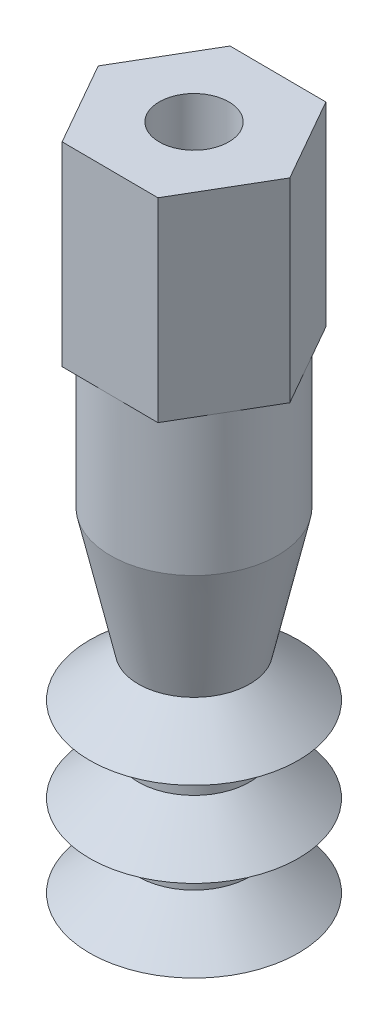
ISO-10303-21;
HEADER;
FILE_DESCRIPTION(('STEP AP214'),'2;1');
FILE_NAME('part.step','',(''),(''),'','','');
FILE_SCHEMA(('AUTOMOTIVE_DESIGN { 1 0 10303 214 1 1 1 1 }'));
ENDSEC;
DATA;
#1=APPLICATION_CONTEXT('core data for automotive mechanical design processes');
#2=APPLICATION_PROTOCOL_DEFINITION('international standard','automotive_design',2000,#1);
#3=PRODUCT_CONTEXT('',#1,'mechanical');
#4=PRODUCT('Part','Part','',(#3));
#5=PRODUCT_RELATED_PRODUCT_CATEGORY('part','',(#4));
#6=PRODUCT_DEFINITION_FORMATION('','',#4);
#7=PRODUCT_DEFINITION_CONTEXT('part definition',#1,'design');
#8=PRODUCT_DEFINITION('design','',#6,#7);
#9=PRODUCT_DEFINITION_SHAPE('','',#8);
#10=(LENGTH_UNIT() NAMED_UNIT(*) SI_UNIT(.MILLI.,.METRE.));
#11=(NAMED_UNIT(*) PLANE_ANGLE_UNIT() SI_UNIT($,.RADIAN.));
#12=(NAMED_UNIT(*) SI_UNIT($,.STERADIAN.) SOLID_ANGLE_UNIT());
#13=UNCERTAINTY_MEASURE_WITH_UNIT(LENGTH_MEASURE(1.E-05),#10,'distance_accuracy_value','');
#14=(GEOMETRIC_REPRESENTATION_CONTEXT(3) GLOBAL_UNCERTAINTY_ASSIGNED_CONTEXT((#13)) GLOBAL_UNIT_ASSIGNED_CONTEXT((#10,
#11,#12)) REPRESENTATION_CONTEXT('',''));
#15=CARTESIAN_POINT('',(0.,0.,0.));
#16=DIRECTION('',(0.,0.,1.));
#17=DIRECTION('',(1.,0.,0.));
#18=AXIS2_PLACEMENT_3D('',#15,#16,#17);
#19=CARTESIAN_POINT('',(0.,0.,0.));
#20=DIRECTION('',(0.,1.,0.));
#21=DIRECTION('',(-1.,0.,0.));
#22=AXIS2_PLACEMENT_3D('',#19,#20,#21);
#23=PLANE('',#22);
#24=CARTESIAN_POINT('',(0.,0.,0.));
#25=DIRECTION('',(0.,1.,0.));
#26=DIRECTION('',(-1.,0.,0.));
#27=AXIS2_PLACEMENT_3D('',#24,#25,#26);
#28=CIRCLE('',#27,6.11706833140607);
#29=CARTESIAN_POINT('',(-6.11706833140607,0.,0.));
#30=VERTEX_POINT('',#29);
#31=EDGE_CURVE('E144',#30,#30,#28,.T.);
#32=ORIENTED_EDGE('',*,*,#31,.T.);
#33=EDGE_LOOP('',(#32));
#34=FACE_BOUND('',#33,.T.);
#35=CARTESIAN_POINT('',(0.,0.,0.));
#36=DIRECTION('',(0.,1.,0.));
#37=DIRECTION('',(-1.,0.,0.));
#38=AXIS2_PLACEMENT_3D('',#35,#36,#37);
#39=CIRCLE('',#38,7.5);
#40=CARTESIAN_POINT('',(-7.5,0.,0.));
#41=VERTEX_POINT('',#40);
#42=EDGE_CURVE('E11',#41,#41,#39,.T.);
#43=ORIENTED_EDGE('',*,*,#42,.F.);
#44=EDGE_LOOP('',(#43));
#45=FACE_BOUND('',#44,.T.);
#46=ADVANCED_FACE('F37',(#34,#45),#23,.F.);
#47=CARTESIAN_POINT('',(0.,0.,0.));
#48=DIRECTION('',(0.,-1.,0.));
#49=DIRECTION('',(1.,0.,0.));
#50=AXIS2_PLACEMENT_3D('',#47,#48,#49);
#51=CONICAL_SURFACE('',#50,7.5,0.862170054667226);
#52=CARTESIAN_POINT('',(0.,3.,0.));
#53=DIRECTION('',(0.,1.,0.));
#54=DIRECTION('',(-1.,0.,0.));
#55=AXIS2_PLACEMENT_3D('',#52,#53,#54);
#56=CIRCLE('',#55,4.);
#57=CARTESIAN_POINT('',(-4.,3.,0.));
#58=VERTEX_POINT('',#57);
#59=EDGE_CURVE('E44',#58,#58,#56,.T.);
#60=ORIENTED_EDGE('',*,*,#59,.F.);
#61=EDGE_LOOP('',(#60));
#62=FACE_BOUND('',#61,.T.);
#63=ORIENTED_EDGE('',*,*,#42,.T.);
#64=EDGE_LOOP('',(#63));
#65=FACE_BOUND('',#64,.T.);
#66=ADVANCED_FACE('F196',(#62,#65),#51,.T.);
#67=CARTESIAN_POINT('',(0.,34.,0.));
#68=DIRECTION('',(0.,1.,0.));
#69=DIRECTION('',(-1.,0.,0.));
#70=AXIS2_PLACEMENT_3D('',#67,#68,#69);
#71=CYLINDRICAL_SURFACE('',#70,4.);
#72=CARTESIAN_POINT('',(0.,5.8970328632918,0.));
#73=DIRECTION('',(0.,1.,0.));
#74=DIRECTION('',(-1.,0.,0.));
#75=AXIS2_PLACEMENT_3D('',#72,#73,#74);
#76=CIRCLE('',#75,4.);
#77=CARTESIAN_POINT('',(-4.,5.8970328632918,0.));
#78=VERTEX_POINT('',#77);
#79=EDGE_CURVE('E189',#78,#78,#76,.T.);
#80=ORIENTED_EDGE('',*,*,#79,.F.);
#81=EDGE_LOOP('',(#80));
#82=FACE_BOUND('',#81,.T.);
#83=ORIENTED_EDGE('',*,*,#59,.T.);
#84=EDGE_LOOP('',(#83));
#85=FACE_BOUND('',#84,.T.);
#86=ADVANCED_FACE('F194',(#82,#85),#71,.T.);
#87=CARTESIAN_POINT('',(7.50000000000001,5.8970328632918,0.));
#88=DIRECTION('',(0.,1.,0.));
#89=DIRECTION('',(-1.,0.,0.));
#90=AXIS2_PLACEMENT_3D('',#87,#88,#89);
#91=PLANE('',#90);
#92=CARTESIAN_POINT('',(0.,5.8970328632918,0.));
#93=DIRECTION('',(0.,1.,0.));
#94=DIRECTION('',(-1.,0.,0.));
#95=AXIS2_PLACEMENT_3D('',#92,#93,#94);
#96=CIRCLE('',#95,7.50000000000001);
#97=CARTESIAN_POINT('',(-7.50000000000001,5.8970328632918,0.));
#98=VERTEX_POINT('',#97);
#99=EDGE_CURVE('E186',#98,#98,#96,.T.);
#100=ORIENTED_EDGE('',*,*,#99,.F.);
#101=EDGE_LOOP('',(#100));
#102=FACE_BOUND('',#101,.T.);
#103=ORIENTED_EDGE('',*,*,#79,.T.);
#104=EDGE_LOOP('',(#103));
#105=FACE_BOUND('',#104,.T.);
#106=ADVANCED_FACE('F275',(#102,#105),#91,.F.);
#107=CARTESIAN_POINT('',(0.,5.8970328632918,0.));
#108=DIRECTION('',(0.,-1.,0.));
#109=DIRECTION('',(1.,0.,0.));
#110=AXIS2_PLACEMENT_3D('',#107,#108,#109);
#111=CONICAL_SURFACE('',#110,7.50000000000001,0.862170054667228);
#112=CARTESIAN_POINT('',(0.,8.8970328632918,0.));
#113=DIRECTION('',(0.,1.,0.));
#114=DIRECTION('',(-1.,0.,0.));
#115=AXIS2_PLACEMENT_3D('',#112,#113,#114);
#116=CIRCLE('',#115,4.);
#117=CARTESIAN_POINT('',(-4.,8.8970328632918,0.));
#118=VERTEX_POINT('',#117);
#119=EDGE_CURVE('E183',#118,#118,#116,.T.);
#120=ORIENTED_EDGE('',*,*,#119,.F.);
#121=EDGE_LOOP('',(#120));
#122=FACE_BOUND('',#121,.T.);
#123=ORIENTED_EDGE('',*,*,#99,.T.);
#124=EDGE_LOOP('',(#123));
#125=FACE_BOUND('',#124,.T.);
#126=ADVANCED_FACE('F271',(#122,#125),#111,.T.);
#127=CARTESIAN_POINT('',(0.,34.,0.));
#128=DIRECTION('',(0.,1.,0.));
#129=DIRECTION('',(-1.,0.,0.));
#130=AXIS2_PLACEMENT_3D('',#127,#128,#129);
#131=CYLINDRICAL_SURFACE('',#130,4.);
#132=CARTESIAN_POINT('',(0.,12.,0.));
#133=DIRECTION('',(0.,1.,0.));
#134=DIRECTION('',(-1.,0.,0.));
#135=AXIS2_PLACEMENT_3D('',#132,#133,#134);
#136=CIRCLE('',#135,4.);
#137=CARTESIAN_POINT('',(-4.,12.,0.));
#138=VERTEX_POINT('',#137);
#139=EDGE_CURVE('E180',#138,#138,#136,.T.);
#140=ORIENTED_EDGE('',*,*,#139,.F.);
#141=EDGE_LOOP('',(#140));
#142=FACE_BOUND('',#141,.T.);
#143=ORIENTED_EDGE('',*,*,#119,.T.);
#144=EDGE_LOOP('',(#143));
#145=FACE_BOUND('',#144,.T.);
#146=ADVANCED_FACE('F267',(#142,#145),#131,.T.);
#147=CARTESIAN_POINT('',(7.5,12.,0.));
#148=DIRECTION('',(0.,1.,0.));
#149=DIRECTION('',(-1.,0.,0.));
#150=AXIS2_PLACEMENT_3D('',#147,#148,#149);
#151=PLANE('',#150);
#152=CARTESIAN_POINT('',(0.,12.,0.));
#153=DIRECTION('',(0.,1.,0.));
#154=DIRECTION('',(-1.,0.,0.));
#155=AXIS2_PLACEMENT_3D('',#152,#153,#154);
#156=CIRCLE('',#155,7.5);
#157=CARTESIAN_POINT('',(-7.5,12.,0.));
#158=VERTEX_POINT('',#157);
#159=EDGE_CURVE('E177',#158,#158,#156,.T.);
#160=ORIENTED_EDGE('',*,*,#159,.F.);
#161=EDGE_LOOP('',(#160));
#162=FACE_BOUND('',#161,.T.);
#163=ORIENTED_EDGE('',*,*,#139,.T.);
#164=EDGE_LOOP('',(#163));
#165=FACE_BOUND('',#164,.T.);
#166=ADVANCED_FACE('F263',(#162,#165),#151,.F.);
#167=CARTESIAN_POINT('',(0.,12.,0.));
#168=DIRECTION('',(0.,-1.,0.));
#169=DIRECTION('',(1.,0.,0.));
#170=AXIS2_PLACEMENT_3D('',#167,#168,#169);
#171=CONICAL_SURFACE('',#170,7.5,0.862170054667227);
#172=CARTESIAN_POINT('',(0.,15.,0.));
#173=DIRECTION('',(0.,1.,0.));
#174=DIRECTION('',(-1.,0.,0.));
#175=AXIS2_PLACEMENT_3D('',#172,#173,#174);
#176=CIRCLE('',#175,4.);
#177=CARTESIAN_POINT('',(-4.,15.,0.));
#178=VERTEX_POINT('',#177);
#179=EDGE_CURVE('E174',#178,#178,#176,.T.);
#180=ORIENTED_EDGE('',*,*,#179,.F.);
#181=EDGE_LOOP('',(#180));
#182=FACE_BOUND('',#181,.T.);
#183=ORIENTED_EDGE('',*,*,#159,.T.);
#184=EDGE_LOOP('',(#183));
#185=FACE_BOUND('',#184,.T.);
#186=ADVANCED_FACE('F259',(#182,#185),#171,.T.);
#187=CARTESIAN_POINT('',(0.,15.,0.));
#188=DIRECTION('',(0.,1.,0.));
#189=DIRECTION('',(-1.,0.,0.));
#190=AXIS2_PLACEMENT_3D('',#187,#188,#189);
#191=CONICAL_SURFACE('',#190,4.,0.218668945873942);
#192=CARTESIAN_POINT('',(0.,24.,0.));
#193=DIRECTION('',(0.,1.,0.));
#194=DIRECTION('',(-1.,0.,0.));
#195=AXIS2_PLACEMENT_3D('',#192,#193,#194);
#196=CIRCLE('',#195,6.);
#197=CARTESIAN_POINT('',(-6.,24.,0.));
#198=VERTEX_POINT('',#197);
#199=EDGE_CURVE('E170',#198,#198,#196,.T.);
#200=ORIENTED_EDGE('',*,*,#199,.F.);
#201=EDGE_LOOP('',(#200));
#202=FACE_BOUND('',#201,.T.);
#203=ORIENTED_EDGE('',*,*,#179,.T.);
#204=EDGE_LOOP('',(#203));
#205=FACE_BOUND('',#204,.T.);
#206=ADVANCED_FACE('F220',(#202,#205),#191,.T.);
#207=CARTESIAN_POINT('',(0.,34.,0.));
#208=DIRECTION('',(0.,1.,0.));
#209=DIRECTION('',(-1.,0.,0.));
#210=AXIS2_PLACEMENT_3D('',#207,#208,#209);
#211=CYLINDRICAL_SURFACE('',#210,6.);
#212=CARTESIAN_POINT('',(0.,34.,0.));
#213=DIRECTION('',(0.,1.,0.));
#214=DIRECTION('',(-1.,0.,0.));
#215=AXIS2_PLACEMENT_3D('',#212,#213,#214);
#216=CIRCLE('',#215,6.);
#217=CARTESIAN_POINT('',(-5.2140315401742,34.,2.96881712102119));
#218=VERTEX_POINT('',#217);
#219=CARTESIAN_POINT('',(-0.0359447240925657,34.,5.99989233043477));
#220=VERTEX_POINT('',#219);
#221=EDGE_CURVE('E167',#218,#220,#216,.T.);
#222=ORIENTED_EDGE('',*,*,#221,.F.);
#223=CARTESIAN_POINT('',(-5.17808681608163,34.,-3.03107520941356));
#224=VERTEX_POINT('',#223);
#225=EDGE_CURVE('E51',#224,#218,#216,.T.);
#226=ORIENTED_EDGE('',*,*,#225,.F.);
#227=CARTESIAN_POINT('',(0.0359447240925705,34.,-5.99989233043476));
#228=VERTEX_POINT('',#227);
#229=EDGE_CURVE('E55',#228,#224,#216,.T.);
#230=ORIENTED_EDGE('',*,*,#229,.F.);
#231=CARTESIAN_POINT('',(5.21403154017421,34.,-2.9688171210212));
#232=VERTEX_POINT('',#231);
#233=EDGE_CURVE('E517',#232,#228,#216,.T.);
#234=ORIENTED_EDGE('',*,*,#233,.F.);
#235=CARTESIAN_POINT('',(5.17808681608164,34.,3.03107520941357));
#236=VERTEX_POINT('',#235);
#237=EDGE_CURVE('E518',#236,#232,#216,.T.);
#238=ORIENTED_EDGE('',*,*,#237,.F.);
#239=EDGE_CURVE('E171',#220,#236,#216,.T.);
#240=ORIENTED_EDGE('',*,*,#239,.F.);
#241=EDGE_LOOP('',(#222,#226,#230,#234,#238,#240));
#242=FACE_BOUND('',#241,.T.);
#243=ORIENTED_EDGE('',*,*,#199,.T.);
#244=EDGE_LOOP('',(#243));
#245=FACE_BOUND('',#244,.T.);
#246=ADVANCED_FACE('F210',(#242,#245),#211,.T.);
#247=CARTESIAN_POINT('',(0.,-0.683330942128767,0.));
#248=DIRECTION('',(0.,-1.,0.));
#249=DIRECTION('',(1.,0.,0.));
#250=AXIS2_PLACEMENT_3D('',#247,#248,#249);
#251=CONICAL_SURFACE('',#250,6.91428776388963,0.862170054667226);
#252=CARTESIAN_POINT('',(0.,2.58605856977663,0.));
#253=DIRECTION('',(0.,-1.,0.));
#254=DIRECTION('',(1.,0.,0.));
#255=AXIS2_PLACEMENT_3D('',#252,#253,#254);
#256=CIRCLE('',#255,3.1);
#257=CARTESIAN_POINT('',(3.1,2.58605856977663,0.));
#258=VERTEX_POINT('',#257);
#259=EDGE_CURVE('E141',#258,#258,#256,.F.);
#260=ORIENTED_EDGE('',*,*,#259,.T.);
#261=EDGE_LOOP('',(#260));
#262=FACE_BOUND('',#261,.T.);
#263=ORIENTED_EDGE('',*,*,#31,.F.);
#264=EDGE_LOOP('',(#263));
#265=FACE_BOUND('',#264,.T.);
#266=ADVANCED_FACE('F207',(#262,#265),#251,.F.);
#267=CARTESIAN_POINT('',(0.,34.,0.));
#268=DIRECTION('',(0.,1.,0.));
#269=DIRECTION('',(-1.,0.,0.));
#270=AXIS2_PLACEMENT_3D('',#267,#268,#269);
#271=CYLINDRICAL_SURFACE('',#270,3.1);
#272=CARTESIAN_POINT('',(0.,6.7970328632918,0.));
#273=DIRECTION('',(0.,1.,0.));
#274=DIRECTION('',(-1.,0.,0.));
#275=AXIS2_PLACEMENT_3D('',#272,#273,#274);
#276=CIRCLE('',#275,3.1);
#277=CARTESIAN_POINT('',(-3.1,6.7970328632918,0.));
#278=VERTEX_POINT('',#277);
#279=EDGE_CURVE('E145',#278,#278,#276,.T.);
#280=ORIENTED_EDGE('',*,*,#279,.T.);
#281=EDGE_LOOP('',(#280));
#282=FACE_BOUND('',#281,.T.);
#283=ORIENTED_EDGE('',*,*,#259,.F.);
#284=EDGE_LOOP('',(#283));
#285=FACE_BOUND('',#284,.T.);
#286=ADVANCED_FACE('F209',(#282,#285),#271,.F.);
#287=CARTESIAN_POINT('',(7.50000000000001,6.7970328632918,0.));
#288=DIRECTION('',(0.,1.,0.));
#289=DIRECTION('',(-1.,0.,0.));
#290=AXIS2_PLACEMENT_3D('',#287,#288,#289);
#291=PLANE('',#290);
#292=CARTESIAN_POINT('',(0.,6.7970328632918,0.));
#293=DIRECTION('',(0.,1.,0.));
#294=DIRECTION('',(-1.,0.,0.));
#295=AXIS2_PLACEMENT_3D('',#292,#293,#294);
#296=CIRCLE('',#295,5.06706833140607);
#297=CARTESIAN_POINT('',(-5.06706833140607,6.7970328632918,0.));
#298=VERTEX_POINT('',#297);
#299=EDGE_CURVE('E148',#298,#298,#296,.T.);
#300=ORIENTED_EDGE('',*,*,#299,.T.);
#301=EDGE_LOOP('',(#300));
#302=FACE_BOUND('',#301,.T.);
#303=ORIENTED_EDGE('',*,*,#279,.F.);
#304=EDGE_LOOP('',(#303));
#305=FACE_BOUND('',#304,.T.);
#306=ADVANCED_FACE('F217',(#302,#305),#291,.T.);
#307=CARTESIAN_POINT('',(0.,5.21370192116303,0.));
#308=DIRECTION('',(0.,-1.,0.));
#309=DIRECTION('',(1.,0.,0.));
#310=AXIS2_PLACEMENT_3D('',#307,#308,#309);
#311=CONICAL_SURFACE('',#310,6.91428776388964,0.862170054667228);
#312=CARTESIAN_POINT('',(0.,8.48309143306843,0.));
#313=DIRECTION('',(0.,-1.,0.));
#314=DIRECTION('',(1.,0.,0.));
#315=AXIS2_PLACEMENT_3D('',#312,#313,#314);
#316=CIRCLE('',#315,3.1);
#317=CARTESIAN_POINT('',(3.1,8.48309143306843,0.));
#318=VERTEX_POINT('',#317);
#319=EDGE_CURVE('E151',#318,#318,#316,.F.);
#320=ORIENTED_EDGE('',*,*,#319,.T.);
#321=EDGE_LOOP('',(#320));
#322=FACE_BOUND('',#321,.T.);
#323=ORIENTED_EDGE('',*,*,#299,.F.);
#324=EDGE_LOOP('',(#323));
#325=FACE_BOUND('',#324,.T.);
#326=ADVANCED_FACE('F227',(#322,#325),#311,.F.);
#327=CARTESIAN_POINT('',(0.,34.,0.));
#328=DIRECTION('',(0.,1.,0.));
#329=DIRECTION('',(-1.,0.,0.));
#330=AXIS2_PLACEMENT_3D('',#327,#328,#329);
#331=CYLINDRICAL_SURFACE('',#330,3.1);
#332=CARTESIAN_POINT('',(0.,12.9,0.));
#333=DIRECTION('',(0.,1.,0.));
#334=DIRECTION('',(-1.,0.,0.));
#335=AXIS2_PLACEMENT_3D('',#332,#333,#334);
#336=CIRCLE('',#335,3.1);
#337=CARTESIAN_POINT('',(-3.1,12.9,0.));
#338=VERTEX_POINT('',#337);
#339=EDGE_CURVE('E154',#338,#338,#336,.T.);
#340=ORIENTED_EDGE('',*,*,#339,.T.);
#341=EDGE_LOOP('',(#340));
#342=FACE_BOUND('',#341,.T.);
#343=ORIENTED_EDGE('',*,*,#319,.F.);
#344=EDGE_LOOP('',(#343));
#345=FACE_BOUND('',#344,.T.);
#346=ADVANCED_FACE('F231',(#342,#345),#331,.F.);
#347=CARTESIAN_POINT('',(7.5,12.9,0.));
#348=DIRECTION('',(0.,1.,0.));
#349=DIRECTION('',(-1.,0.,0.));
#350=AXIS2_PLACEMENT_3D('',#347,#348,#349);
#351=PLANE('',#350);
#352=CARTESIAN_POINT('',(0.,12.9,0.));
#353=DIRECTION('',(0.,1.,0.));
#354=DIRECTION('',(-1.,0.,0.));
#355=AXIS2_PLACEMENT_3D('',#352,#353,#354);
#356=CIRCLE('',#355,5.06706833140607);
#357=CARTESIAN_POINT('',(-5.06706833140607,12.9,0.));
#358=VERTEX_POINT('',#357);
#359=EDGE_CURVE('E157',#358,#358,#356,.T.);
#360=ORIENTED_EDGE('',*,*,#359,.T.);
#361=EDGE_LOOP('',(#360));
#362=FACE_BOUND('',#361,.T.);
#363=ORIENTED_EDGE('',*,*,#339,.F.);
#364=EDGE_LOOP('',(#363));
#365=FACE_BOUND('',#364,.T.);
#366=ADVANCED_FACE('F235',(#362,#365),#351,.T.);
#367=CARTESIAN_POINT('',(0.,11.3166690578712,0.));
#368=DIRECTION('',(0.,-1.,0.));
#369=DIRECTION('',(1.,0.,0.));
#370=AXIS2_PLACEMENT_3D('',#367,#368,#369);
#371=CONICAL_SURFACE('',#370,6.91428776388963,0.862170054667227);
#372=CARTESIAN_POINT('',(0.,14.6680963995375,0.));
#373=DIRECTION('',(0.,1.,0.));
#374=DIRECTION('',(-1.,0.,0.));
#375=AXIS2_PLACEMENT_3D('',#372,#373,#374);
#376=CIRCLE('',#375,3.00428919861237);
#377=CARTESIAN_POINT('',(-3.00428919861237,14.6680963995375,0.));
#378=VERTEX_POINT('',#377);
#379=EDGE_CURVE('E160',#378,#378,#376,.T.);
#380=ORIENTED_EDGE('',*,*,#379,.T.);
#381=EDGE_LOOP('',(#380));
#382=FACE_BOUND('',#381,.T.);
#383=ORIENTED_EDGE('',*,*,#359,.F.);
#384=EDGE_LOOP('',(#383));
#385=FACE_BOUND('',#384,.T.);
#386=ADVANCED_FACE('F239',(#382,#385),#371,.F.);
#387=CARTESIAN_POINT('',(0.,15.1952374120368,0.));
#388=DIRECTION('',(0.,1.,0.));
#389=DIRECTION('',(-1.,0.,0.));
#390=AXIS2_PLACEMENT_3D('',#387,#388,#389);
#391=CONICAL_SURFACE('',#390,3.12143164583444,0.218668945873942);
#392=CARTESIAN_POINT('',(0.,24.0987950057818,0.));
#393=DIRECTION('',(0.,1.,0.));
#394=DIRECTION('',(-1.,0.,0.));
#395=AXIS2_PLACEMENT_3D('',#392,#393,#394);
#396=CIRCLE('',#395,5.1);
#397=CARTESIAN_POINT('',(-5.1,24.0987950057818,0.));
#398=VERTEX_POINT('',#397);
#399=EDGE_CURVE('E135',#398,#398,#396,.T.);
#400=ORIENTED_EDGE('',*,*,#399,.T.);
#401=EDGE_LOOP('',(#400));
#402=FACE_BOUND('',#401,.T.);
#403=ORIENTED_EDGE('',*,*,#379,.F.);
#404=EDGE_LOOP('',(#403));
#405=FACE_BOUND('',#404,.T.);
#406=ADVANCED_FACE('F243',(#402,#405),#391,.F.);
#407=CARTESIAN_POINT('',(0.,34.,0.));
#408=DIRECTION('',(0.,1.,0.));
#409=DIRECTION('',(-1.,0.,0.));
#410=AXIS2_PLACEMENT_3D('',#407,#408,#409);
#411=CYLINDRICAL_SURFACE('',#410,5.1);
#412=CARTESIAN_POINT('',(0.,33.1,0.));
#413=DIRECTION('',(0.,-1.,0.));
#414=DIRECTION('',(1.,0.,0.));
#415=AXIS2_PLACEMENT_3D('',#412,#413,#414);
#416=CIRCLE('',#415,5.1);
#417=CARTESIAN_POINT('',(5.1,33.1,0.));
#418=VERTEX_POINT('',#417);
#419=EDGE_CURVE('E132',#418,#418,#416,.F.);
#420=ORIENTED_EDGE('',*,*,#419,.T.);
#421=EDGE_LOOP('',(#420));
#422=FACE_BOUND('',#421,.T.);
#423=ORIENTED_EDGE('',*,*,#399,.F.);
#424=EDGE_LOOP('',(#423));
#425=FACE_BOUND('',#424,.T.);
#426=ADVANCED_FACE('F247',(#422,#425),#411,.F.);
#427=CARTESIAN_POINT('',(6.,33.1,0.));
#428=DIRECTION('',(0.,-1.,0.));
#429=DIRECTION('',(1.,0.,0.));
#430=AXIS2_PLACEMENT_3D('',#427,#428,#429);
#431=PLANE('',#430);
#432=CARTESIAN_POINT('',(0.,33.1,0.));
#433=DIRECTION('',(0.,-1.,0.));
#434=DIRECTION('',(1.,0.,0.));
#435=AXIS2_PLACEMENT_3D('',#432,#433,#434);
#436=CIRCLE('',#435,2.5);
#437=CARTESIAN_POINT('',(2.5,33.1,0.));
#438=VERTEX_POINT('',#437);
#439=EDGE_CURVE('E464',#438,#438,#436,.T.);
#440=ORIENTED_EDGE('',*,*,#439,.F.);
#441=EDGE_LOOP('',(#440));
#442=FACE_BOUND('',#441,.T.);
#443=ORIENTED_EDGE('',*,*,#419,.F.);
#444=EDGE_LOOP('',(#443));
#445=FACE_BOUND('',#444,.T.);
#446=ADVANCED_FACE('F251',(#442,#445),#431,.T.);
#447=CARTESIAN_POINT('',(0.,34.,0.));
#448=DIRECTION('',(0.,1.,0.));
#449=DIRECTION('',(0.,0.,1.));
#450=AXIS2_PLACEMENT_3D('',#447,#448,#449);
#451=PLANE('',#450);
#452=DIRECTION('',(0.494802853503533,0.,0.869005256695701));
#453=VECTOR('',#452,1.);
#454=CARTESIAN_POINT('',(-6.92807890417055,34.,-0.0415053922615802));
#455=LINE('',#454,#453);
#456=CARTESIAN_POINT('',(-3.49998417617784,34.,5.97913963430398));
#457=VERTEX_POINT('',#456);
#458=EDGE_CURVE('E487',#218,#457,#455,.T.);
#459=ORIENTED_EDGE('',*,*,#458,.F.);
#460=ORIENTED_EDGE('',*,*,#221,.T.);
#461=DIRECTION('',(0.999982055072461,0.,0.00599078734876129));
#462=VECTOR('',#461,1.);
#463=CARTESIAN_POINT('',(-3.49998417617784,34.,5.97913963430398));
#464=LINE('',#463,#462);
#465=EDGE_CURVE('E492',#457,#220,#464,.T.);
#466=ORIENTED_EDGE('',*,*,#465,.F.);
#467=EDGE_LOOP('',(#459,#460,#466));
#468=FACE_BOUND('',#467,.T.);
#469=ADVANCED_FACE('F254',(#468),#451,.F.);
#470=CARTESIAN_POINT('',(3.42809472799271,34.,6.02064502656556));
#471=VERTEX_POINT('',#470);
#472=EDGE_CURVE('E491',#220,#471,#464,.T.);
#473=ORIENTED_EDGE('',*,*,#472,.F.);
#474=ORIENTED_EDGE('',*,*,#239,.T.);
#475=DIRECTION('',(0.505179201568928,0.,-0.86301446934694));
#476=VECTOR('',#475,1.);
#477=CARTESIAN_POINT('',(3.42809472799271,34.,6.02064502656556));
#478=LINE('',#477,#476);
#479=EDGE_CURVE('E125',#471,#236,#478,.T.);
#480=ORIENTED_EDGE('',*,*,#479,.F.);
#481=EDGE_LOOP('',(#473,#474,#480));
#482=FACE_BOUND('',#481,.T.);
#483=ADVANCED_FACE('F332',(#482),#451,.F.);
#484=CARTESIAN_POINT('',(6.92807890417057,34.,0.0415053922615819));
#485=VERTEX_POINT('',#484);
#486=EDGE_CURVE('E495',#236,#485,#478,.T.);
#487=ORIENTED_EDGE('',*,*,#486,.F.);
#488=ORIENTED_EDGE('',*,*,#237,.T.);
#489=DIRECTION('',(-0.494802853503533,0.,-0.869005256695701));
#490=VECTOR('',#489,1.);
#491=CARTESIAN_POINT('',(6.92807890417057,34.,0.0415053922615819));
#492=LINE('',#491,#490);
#493=EDGE_CURVE('E478',#485,#232,#492,.T.);
#494=ORIENTED_EDGE('',*,*,#493,.F.);
#495=EDGE_LOOP('',(#487,#488,#494));
#496=FACE_BOUND('',#495,.T.);
#497=ADVANCED_FACE('F344',(#496),#451,.F.);
#498=CARTESIAN_POINT('',(3.49998417617785,34.,-5.97913963430397));
#499=VERTEX_POINT('',#498);
#500=EDGE_CURVE('E130',#232,#499,#492,.T.);
#501=ORIENTED_EDGE('',*,*,#500,.F.);
#502=ORIENTED_EDGE('',*,*,#233,.T.);
#503=DIRECTION('',(-0.999982055072461,0.,-0.00599078734876141));
#504=VECTOR('',#503,1.);
#505=CARTESIAN_POINT('',(3.49998417617785,34.,-5.97913963430397));
#506=LINE('',#505,#504);
#507=EDGE_CURVE('E481',#499,#228,#506,.T.);
#508=ORIENTED_EDGE('',*,*,#507,.F.);
#509=EDGE_LOOP('',(#501,#502,#508));
#510=FACE_BOUND('',#509,.T.);
#511=ADVANCED_FACE('F353',(#510),#451,.F.);
#512=CARTESIAN_POINT('',(-3.4280947279927,34.,-6.02064502656555));
#513=VERTEX_POINT('',#512);
#514=EDGE_CURVE('E480',#228,#513,#506,.T.);
#515=ORIENTED_EDGE('',*,*,#514,.F.);
#516=ORIENTED_EDGE('',*,*,#229,.T.);
#517=DIRECTION('',(-0.505179201568928,0.,0.86301446934694));
#518=VECTOR('',#517,1.);
#519=CARTESIAN_POINT('',(-3.4280947279927,34.,-6.02064502656555));
#520=LINE('',#519,#518);
#521=EDGE_CURVE('E484',#513,#224,#520,.T.);
#522=ORIENTED_EDGE('',*,*,#521,.F.);
#523=EDGE_LOOP('',(#515,#516,#522));
#524=FACE_BOUND('',#523,.T.);
#525=ADVANCED_FACE('F362',(#524),#451,.F.);
#526=CARTESIAN_POINT('',(-6.92807890417055,34.,-0.0415053922615802));
#527=VERTEX_POINT('',#526);
#528=EDGE_CURVE('E483',#224,#527,#520,.T.);
#529=ORIENTED_EDGE('',*,*,#528,.F.);
#530=ORIENTED_EDGE('',*,*,#225,.T.);
#531=EDGE_CURVE('E488',#527,#218,#455,.T.);
#532=ORIENTED_EDGE('',*,*,#531,.F.);
#533=EDGE_LOOP('',(#529,#530,#532));
#534=FACE_BOUND('',#533,.T.);
#535=ADVANCED_FACE('F335',(#534),#451,.F.);
#536=CARTESIAN_POINT('',(6.92807890417057,48.,0.0415053922615819));
#537=DIRECTION('',(-0.869005256695701,0.,0.494802853503533));
#538=DIRECTION('',(0.494802853503533,0.,0.869005256695701));
#539=AXIS2_PLACEMENT_3D('',#536,#537,#538);
#540=PLANE('',#539);
#541=ORIENTED_EDGE('',*,*,#493,.T.);
#542=ORIENTED_EDGE('',*,*,#500,.T.);
#543=DIRECTION('',(0.,-1.,0.));
#544=VECTOR('',#543,1.);
#545=CARTESIAN_POINT('',(3.49998417617785,48.,-5.97913963430397));
#546=LINE('',#545,#544);
#547=CARTESIAN_POINT('',(3.49998417617785,48.,-5.97913963430397));
#548=VERTEX_POINT('',#547);
#549=EDGE_CURVE('E110',#548,#499,#546,.T.);
#550=ORIENTED_EDGE('',*,*,#549,.F.);
#551=DIRECTION('',(-0.494802853503533,0.,-0.869005256695701));
#552=VECTOR('',#551,1.);
#553=CARTESIAN_POINT('',(6.92807890417057,48.,0.0415053922615819));
#554=LINE('',#553,#552);
#555=CARTESIAN_POINT('',(6.92807890417057,48.,0.0415053922615819));
#556=VERTEX_POINT('',#555);
#557=EDGE_CURVE('E116',#556,#548,#554,.T.);
#558=ORIENTED_EDGE('',*,*,#557,.F.);
#559=DIRECTION('',(0.,-1.,0.));
#560=VECTOR('',#559,1.);
#561=CARTESIAN_POINT('',(6.92807890417057,48.,0.0415053922615819));
#562=LINE('',#561,#560);
#563=EDGE_CURVE('E477',#556,#485,#562,.T.);
#564=ORIENTED_EDGE('',*,*,#563,.T.);
#565=EDGE_LOOP('',(#541,#542,#550,#558,#564));
#566=FACE_BOUND('',#565,.T.);
#567=ADVANCED_FACE('F128',(#566),#540,.F.);
#568=CARTESIAN_POINT('',(3.49998417617785,48.,-5.97913963430397));
#569=DIRECTION('',(-0.00599078734876141,0.,0.999982055072461));
#570=DIRECTION('',(0.999982055072461,0.,0.00599078734876141));
#571=AXIS2_PLACEMENT_3D('',#568,#569,#570);
#572=PLANE('',#571);
#573=ORIENTED_EDGE('',*,*,#507,.T.);
#574=ORIENTED_EDGE('',*,*,#514,.T.);
#575=DIRECTION('',(0.,-1.,0.));
#576=VECTOR('',#575,1.);
#577=CARTESIAN_POINT('',(-3.4280947279927,48.,-6.02064502656555));
#578=LINE('',#577,#576);
#579=CARTESIAN_POINT('',(-3.4280947279927,48.,-6.02064502656555));
#580=VERTEX_POINT('',#579);
#581=EDGE_CURVE('E112',#580,#513,#578,.T.);
#582=ORIENTED_EDGE('',*,*,#581,.F.);
#583=DIRECTION('',(-0.999982055072461,0.,-0.00599078734876141));
#584=VECTOR('',#583,1.);
#585=CARTESIAN_POINT('',(3.49998417617785,48.,-5.97913963430397));
#586=LINE('',#585,#584);
#587=EDGE_CURVE('E105',#548,#580,#586,.T.);
#588=ORIENTED_EDGE('',*,*,#587,.F.);
#589=ORIENTED_EDGE('',*,*,#549,.T.);
#590=EDGE_LOOP('',(#573,#574,#582,#588,#589));
#591=FACE_BOUND('',#590,.T.);
#592=ADVANCED_FACE('F108',(#591),#572,.F.);
#593=CARTESIAN_POINT('',(-3.4280947279927,48.,-6.02064502656555));
#594=DIRECTION('',(0.86301446934694,0.,0.505179201568928));
#595=DIRECTION('',(0.505179201568928,0.,-0.86301446934694));
#596=AXIS2_PLACEMENT_3D('',#593,#594,#595);
#597=PLANE('',#596);
#598=ORIENTED_EDGE('',*,*,#521,.T.);
#599=ORIENTED_EDGE('',*,*,#528,.T.);
#600=DIRECTION('',(0.,-1.,0.));
#601=VECTOR('',#600,1.);
#602=CARTESIAN_POINT('',(-6.92807890417055,48.,-0.0415053922615802));
#603=LINE('',#602,#601);
#604=CARTESIAN_POINT('',(-6.92807890417055,48.,-0.0415053922615802));
#605=VERTEX_POINT('',#604);
#606=EDGE_CURVE('E137',#605,#527,#603,.T.);
#607=ORIENTED_EDGE('',*,*,#606,.F.);
#608=DIRECTION('',(-0.505179201568928,0.,0.86301446934694));
#609=VECTOR('',#608,1.);
#610=CARTESIAN_POINT('',(-3.4280947279927,48.,-6.02064502656555));
#611=LINE('',#610,#609);
#612=EDGE_CURVE('E115',#580,#605,#611,.T.);
#613=ORIENTED_EDGE('',*,*,#612,.F.);
#614=ORIENTED_EDGE('',*,*,#581,.T.);
#615=EDGE_LOOP('',(#598,#599,#607,#613,#614));
#616=FACE_BOUND('',#615,.T.);
#617=ADVANCED_FACE('F394',(#616),#597,.F.);
#618=CARTESIAN_POINT('',(-6.92807890417055,48.,-0.0415053922615802));
#619=DIRECTION('',(0.869005256695701,0.,-0.494802853503533));
#620=DIRECTION('',(-0.494802853503533,0.,-0.869005256695701));
#621=AXIS2_PLACEMENT_3D('',#618,#619,#620);
#622=PLANE('',#621);
#623=ORIENTED_EDGE('',*,*,#531,.T.);
#624=ORIENTED_EDGE('',*,*,#458,.T.);
#625=DIRECTION('',(0.,-1.,0.));
#626=VECTOR('',#625,1.);
#627=CARTESIAN_POINT('',(-3.49998417617784,48.,5.97913963430398));
#628=LINE('',#627,#626);
#629=CARTESIAN_POINT('',(-3.49998417617784,48.,5.97913963430398));
#630=VERTEX_POINT('',#629);
#631=EDGE_CURVE('E502',#630,#457,#628,.T.);
#632=ORIENTED_EDGE('',*,*,#631,.F.);
#633=DIRECTION('',(0.494802853503533,0.,0.869005256695701));
#634=VECTOR('',#633,1.);
#635=CARTESIAN_POINT('',(-6.92807890417055,48.,-0.0415053922615802));
#636=LINE('',#635,#634);
#637=EDGE_CURVE('E472',#605,#630,#636,.T.);
#638=ORIENTED_EDGE('',*,*,#637,.F.);
#639=ORIENTED_EDGE('',*,*,#606,.T.);
#640=EDGE_LOOP('',(#623,#624,#632,#638,#639));
#641=FACE_BOUND('',#640,.T.);
#642=ADVANCED_FACE('F402',(#641),#622,.F.);
#643=CARTESIAN_POINT('',(-3.49998417617784,48.,5.97913963430398));
#644=DIRECTION('',(0.00599078734876129,0.,-0.999982055072461));
#645=DIRECTION('',(-0.999982055072461,0.,-0.00599078734876129));
#646=AXIS2_PLACEMENT_3D('',#643,#644,#645);
#647=PLANE('',#646);
#648=ORIENTED_EDGE('',*,*,#465,.T.);
#649=ORIENTED_EDGE('',*,*,#472,.T.);
#650=DIRECTION('',(0.,-1.,0.));
#651=VECTOR('',#650,1.);
#652=CARTESIAN_POINT('',(3.42809472799272,48.,6.02064502656556));
#653=LINE('',#652,#651);
#654=CARTESIAN_POINT('',(3.42809472799272,48.,6.02064502656556));
#655=VERTEX_POINT('',#654);
#656=EDGE_CURVE('E499',#655,#471,#653,.T.);
#657=ORIENTED_EDGE('',*,*,#656,.F.);
#658=DIRECTION('',(0.999982055072461,0.,0.00599078734876129));
#659=VECTOR('',#658,1.);
#660=CARTESIAN_POINT('',(-3.49998417617784,48.,5.97913963430398));
#661=LINE('',#660,#659);
#662=EDGE_CURVE('E474',#630,#655,#661,.T.);
#663=ORIENTED_EDGE('',*,*,#662,.F.);
#664=ORIENTED_EDGE('',*,*,#631,.T.);
#665=EDGE_LOOP('',(#648,#649,#657,#663,#664));
#666=FACE_BOUND('',#665,.T.);
#667=ADVANCED_FACE('F412',(#666),#647,.F.);
#668=CARTESIAN_POINT('',(3.42809472799272,48.,6.02064502656556));
#669=DIRECTION('',(-0.86301446934694,0.,-0.505179201568928));
#670=DIRECTION('',(-0.505179201568928,0.,0.86301446934694));
#671=AXIS2_PLACEMENT_3D('',#668,#669,#670);
#672=PLANE('',#671);
#673=ORIENTED_EDGE('',*,*,#479,.T.);
#674=ORIENTED_EDGE('',*,*,#486,.T.);
#675=ORIENTED_EDGE('',*,*,#563,.F.);
#676=DIRECTION('',(0.505179201568928,0.,-0.86301446934694));
#677=VECTOR('',#676,1.);
#678=CARTESIAN_POINT('',(3.42809472799272,48.,6.02064502656556));
#679=LINE('',#678,#677);
#680=EDGE_CURVE('E121',#655,#556,#679,.T.);
#681=ORIENTED_EDGE('',*,*,#680,.F.);
#682=ORIENTED_EDGE('',*,*,#656,.T.);
#683=EDGE_LOOP('',(#673,#674,#675,#681,#682));
#684=FACE_BOUND('',#683,.T.);
#685=ADVANCED_FACE('F422',(#684),#672,.F.);
#686=CARTESIAN_POINT('',(0.,48.,0.));
#687=DIRECTION('',(0.,1.,0.));
#688=DIRECTION('',(0.,0.,1.));
#689=AXIS2_PLACEMENT_3D('',#686,#687,#688);
#690=PLANE('',#689);
#691=CARTESIAN_POINT('',(0.,48.,0.));
#692=DIRECTION('',(0.,1.,0.));
#693=DIRECTION('',(0.,0.,1.));
#694=AXIS2_PLACEMENT_3D('',#691,#692,#693);
#695=CIRCLE('',#694,2.5);
#696=CARTESIAN_POINT('',(0.,48.,2.5));
#697=VERTEX_POINT('',#696);
#698=EDGE_CURVE('E467',#697,#697,#695,.T.);
#699=ORIENTED_EDGE('',*,*,#698,.F.);
#700=EDGE_LOOP('',(#699));
#701=FACE_BOUND('',#700,.T.);
#702=ORIENTED_EDGE('',*,*,#557,.T.);
#703=ORIENTED_EDGE('',*,*,#587,.T.);
#704=ORIENTED_EDGE('',*,*,#612,.T.);
#705=ORIENTED_EDGE('',*,*,#637,.T.);
#706=ORIENTED_EDGE('',*,*,#662,.T.);
#707=ORIENTED_EDGE('',*,*,#680,.T.);
#708=EDGE_LOOP('',(#702,#703,#704,#705,#706,#707));
#709=FACE_BOUND('',#708,.T.);
#710=ADVANCED_FACE('F119',(#701,#709),#690,.T.);
#711=CARTESIAN_POINT('',(0.,0.,0.));
#712=DIRECTION('',(0.,1.,0.));
#713=DIRECTION('',(0.,0.,1.));
#714=AXIS2_PLACEMENT_3D('',#711,#712,#713);
#715=CYLINDRICAL_SURFACE('',#714,2.5);
#716=ORIENTED_EDGE('',*,*,#439,.T.);
#717=EDGE_LOOP('',(#716));
#718=FACE_BOUND('',#717,.T.);
#719=ORIENTED_EDGE('',*,*,#698,.T.);
#720=EDGE_LOOP('',(#719));
#721=FACE_BOUND('',#720,.T.);
#722=ADVANCED_FACE('F447',(#718,#721),#715,.F.);
#723=CLOSED_SHELL('',(#46,#66,#86,#106,#126,#146,#166,#186,#206,#246,#266,#286,#306,#326,#346,
#366,#386,#406,#426,#446,#469,#483,#497,#511,#525,#535,#567,#592,#617,#642,#667,#685,#710,#722));
#724=MANIFOLD_SOLID_BREP('B2',#723);
#725=ADVANCED_BREP_SHAPE_REPRESENTATION('',(#18,#724),#14);
#726=SHAPE_DEFINITION_REPRESENTATION(#9,#725);
ENDSEC;
END-ISO-10303-21;
